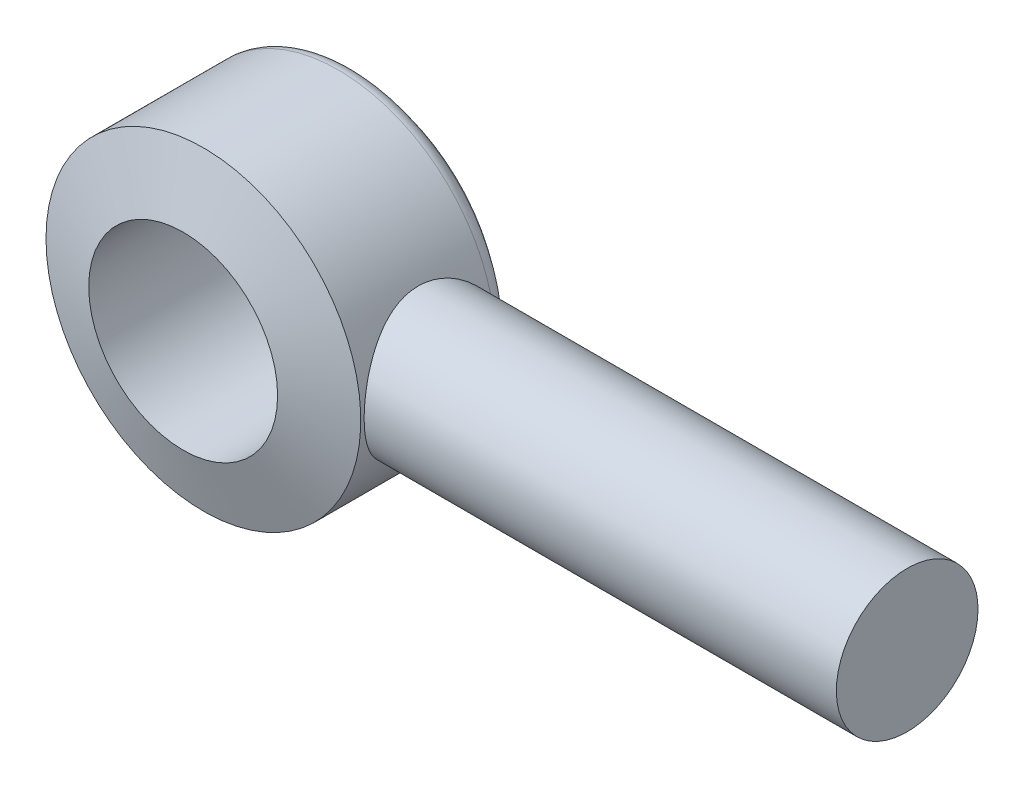
ISO-10303-21;
HEADER;
FILE_DESCRIPTION(('STEP AP214'),'2;1');
FILE_NAME('part.step','',(''),(''),'','','');
FILE_SCHEMA(('AUTOMOTIVE_DESIGN { 1 0 10303 214 1 1 1 1 }'));
ENDSEC;
DATA;
#1=APPLICATION_CONTEXT('core data for automotive mechanical design processes');
#2=APPLICATION_PROTOCOL_DEFINITION('international standard','automotive_design',2000,#1);
#3=PRODUCT_CONTEXT('',#1,'mechanical');
#4=PRODUCT('Part','Part','',(#3));
#5=PRODUCT_RELATED_PRODUCT_CATEGORY('part','',(#4));
#6=PRODUCT_DEFINITION_FORMATION('','',#4);
#7=PRODUCT_DEFINITION_CONTEXT('part definition',#1,'design');
#8=PRODUCT_DEFINITION('design','',#6,#7);
#9=PRODUCT_DEFINITION_SHAPE('','',#8);
#10=(LENGTH_UNIT() NAMED_UNIT(*) SI_UNIT(.MILLI.,.METRE.));
#11=(NAMED_UNIT(*) PLANE_ANGLE_UNIT() SI_UNIT($,.RADIAN.));
#12=(NAMED_UNIT(*) SI_UNIT($,.STERADIAN.) SOLID_ANGLE_UNIT());
#13=UNCERTAINTY_MEASURE_WITH_UNIT(LENGTH_MEASURE(1.E-05),#10,'distance_accuracy_value','');
#14=(GEOMETRIC_REPRESENTATION_CONTEXT(3) GLOBAL_UNCERTAINTY_ASSIGNED_CONTEXT((#13)) GLOBAL_UNIT_ASSIGNED_CONTEXT((#10,
#11,#12)) REPRESENTATION_CONTEXT('',''));
#15=CARTESIAN_POINT('',(0.,0.,0.));
#16=DIRECTION('',(0.,0.,1.));
#17=DIRECTION('',(1.,0.,0.));
#18=AXIS2_PLACEMENT_3D('',#15,#16,#17);
#19=CARTESIAN_POINT('',(0.,0.,-10.));
#20=DIRECTION('',(0.,0.,-1.));
#21=DIRECTION('',(-1.,0.,0.));
#22=AXIS2_PLACEMENT_3D('',#19,#20,#21);
#23=CYLINDRICAL_SURFACE('',#22,20.);
#24=CARTESIAN_POINT('',(0.,0.,9.43017797204027));
#25=DIRECTION('',(0.,0.,-1.));
#26=DIRECTION('',(-1.,0.,0.));
#27=AXIS2_PLACEMENT_3D('',#24,#25,#26);
#28=CIRCLE('',#27,20.);
#29=CARTESIAN_POINT('',(-20.,0.,9.43017797204027));
#30=VERTEX_POINT('',#29);
#31=EDGE_CURVE('E83',#30,#30,#28,.T.);
#32=ORIENTED_EDGE('',*,*,#31,.T.);
#33=EDGE_LOOP('',(#32));
#34=FACE_BOUND('',#33,.T.);
#35=CARTESIAN_POINT('',(20.,0.,9.));
#36=CARTESIAN_POINT('',(19.9999985064092,-0.239429787521762,8.99999822674481));
#37=CARTESIAN_POINT('',(19.9956892903757,-0.478916426072318,8.99043321478664));
#38=CARTESIAN_POINT('',(19.9785592942605,-0.956162020026687,8.95226864130849));
#39=CARTESIAN_POINT('',(19.965733761182,-1.19391993566993,8.92365845056188));
#40=CARTESIAN_POINT('',(19.9318736584215,-1.66631126554467,8.84764081808999));
#41=CARTESIAN_POINT('',(19.9108226830594,-1.90093746029759,8.80019580719452));
#42=CARTESIAN_POINT('',(19.8610585063253,-2.36491141890117,8.68701475770776));
#43=CARTESIAN_POINT('',(19.8323447580828,-2.5942588047487,8.62127741363003));
#44=CARTESIAN_POINT('',(19.7681022982331,-3.04529734881632,8.47244678985055));
#45=CARTESIAN_POINT('',(19.7325992510457,-3.26701374275262,8.38941876914481));
#46=CARTESIAN_POINT('',(19.6555728959035,-3.70234023900251,8.20660801672636));
#47=CARTESIAN_POINT('',(19.6140494060633,-3.91595009616117,8.10682477880271));
#48=CARTESIAN_POINT('',(19.5259822178753,-4.33377259634432,7.89136497837355));
#49=CARTESIAN_POINT('',(19.4794409340425,-4.53798969218329,7.77569605263848));
#50=CARTESIAN_POINT('',(19.3823697488822,-4.93616834197874,7.52921588944175));
#51=CARTESIAN_POINT('',(19.3318383966538,-5.13012612215117,7.39839913566407));
#52=CARTESIAN_POINT('',(19.2252516511163,-5.51651224739533,7.11536110827233));
#53=CARTESIAN_POINT('',(19.1690457622511,-5.70834540295415,6.9623837252373));
#54=CARTESIAN_POINT('',(19.0548708618976,-6.07860491986334,6.64157900949721));
#55=CARTESIAN_POINT('',(18.9969017713971,-6.25703067915748,6.47375101066448));
#56=CARTESIAN_POINT('',(18.880592194074,-6.59969716817025,6.12404836453865));
#57=CARTESIAN_POINT('',(18.8222514632243,-6.76392725578708,5.94216336929638));
#58=CARTESIAN_POINT('',(18.7067409433213,-7.07712505064923,5.56545458817474));
#59=CARTESIAN_POINT('',(18.6495707822957,-7.2260976684338,5.37063499871256));
#60=CARTESIAN_POINT('',(18.5345311652062,-7.516447766657,4.95688022972719));
#61=CARTESIAN_POINT('',(18.4768262488237,-7.65683040733289,4.73719938586506));
#62=CARTESIAN_POINT('',(18.3662455819156,-7.9184082128268,4.28565725378554));
#63=CARTESIAN_POINT('',(18.3133678154643,-8.03961140306554,4.05380111455893));
#64=CARTESIAN_POINT('',(18.2142115054809,-8.26179801329656,3.57928810590723));
#65=CARTESIAN_POINT('',(18.1679314380325,-8.36278610469526,3.33663374766755));
#66=CARTESIAN_POINT('',(18.0836512940779,-8.54350708508813,2.8421404498764));
#67=CARTESIAN_POINT('',(18.0456504851488,-8.62324185439244,2.59030232506773));
#68=CARTESIAN_POINT('',(17.9811920446581,-8.75682239914521,2.09302617540733));
#69=CARTESIAN_POINT('',(17.9542263959317,-8.81182321590082,1.84796444302761));
#70=CARTESIAN_POINT('',(17.9100690134956,-8.90123170952957,1.35323614575337));
#71=CARTESIAN_POINT('',(17.8928769341626,-8.93564011461572,1.10356974401648));
#72=CARTESIAN_POINT('',(17.8689540131125,-8.983384615928,0.601878211112212));
#73=CARTESIAN_POINT('',(17.862216946963,-8.99673325024852,0.34985457332427));
#74=CARTESIAN_POINT('',(17.8594595772848,-9.00220633858546,-0.154473717097972));
#75=CARTESIAN_POINT('',(17.8634385573798,-8.99433221136058,-0.406778349820423));
#76=CARTESIAN_POINT('',(17.8810873984619,-8.95918756232712,-0.886151715448358));
#77=CARTESIAN_POINT('',(17.8938260789646,-8.93378003766404,-1.11339448767851));
#78=CARTESIAN_POINT('',(17.927571759319,-8.86586762542431,-1.56476590212196));
#79=CARTESIAN_POINT('',(17.9485815636106,-8.82335693867436,-1.78889346136545));
#80=CARTESIAN_POINT('',(17.9981983804691,-8.72169967723377,-2.23242328121026));
#81=CARTESIAN_POINT('',(18.0268038175066,-8.66255655238773,-2.4518265115671));
#82=CARTESIAN_POINT('',(18.0907644553137,-8.52817531283848,-2.88472086941824));
#83=CARTESIAN_POINT('',(18.1261223186502,-8.45293084775861,-3.09820962660947));
#84=CARTESIAN_POINT('',(18.2034273739602,-8.28516411480901,-3.52268171477743));
#85=CARTESIAN_POINT('',(18.245503223284,-8.19229591841558,-3.73350468647988));
#86=CARTESIAN_POINT('',(18.3345094937334,-7.99111131313484,-4.14668124990887));
#87=CARTESIAN_POINT('',(18.3814419924008,-7.88278828552695,-4.34903116467067));
#88=CARTESIAN_POINT('',(18.4789403884393,-7.65143878691375,-4.74425148038292));
#89=CARTESIAN_POINT('',(18.529506718669,-7.52841056307743,-4.9371207473839));
#90=CARTESIAN_POINT('',(18.6330430772117,-7.26837600260638,-5.31251862824745));
#91=CARTESIAN_POINT('',(18.6860132626551,-7.13136875148583,-5.49504656438016));
#92=CARTESIAN_POINT('',(18.7985189099995,-6.82965137855831,-5.8667508151223));
#93=CARTESIAN_POINT('',(18.8581795779558,-6.66354094355835,-6.05475471792475));
#94=CARTESIAN_POINT('',(18.9773217315881,-6.31624490447285,-6.41621795234593));
#95=CARTESIAN_POINT('',(19.0368032659127,-6.13506386579452,-6.58968165695454));
#96=CARTESIAN_POINT('',(19.1541031253549,-5.75840783413117,-6.92125209864595));
#97=CARTESIAN_POINT('',(19.2119202579301,-5.56292293099043,-7.0793480084468));
#98=CARTESIAN_POINT('',(19.3243324773812,-5.15888778973217,-7.37896361082567));
#99=CARTESIAN_POINT('',(19.3789288480891,-4.95034282678133,-7.52048993068443));
#100=CARTESIAN_POINT('',(19.4851436633983,-4.51453513177018,-7.79016476175079));
#101=CARTESIAN_POINT('',(19.5366153637798,-4.28689080080715,-7.9177557300782));
#102=CARTESIAN_POINT('',(19.6331930852758,-3.82027307220348,-8.15314635835191));
#103=CARTESIAN_POINT('',(19.6782988971242,-3.58129930247428,-8.26094536771092));
#104=CARTESIAN_POINT('',(19.7608038392733,-3.09381683800418,-8.45559807156982));
#105=CARTESIAN_POINT('',(19.7982069784098,-2.84531318336057,-8.5424626653597));
#106=CARTESIAN_POINT('',(19.8642006994343,-2.34057316338715,-8.69431727759214));
#107=CARTESIAN_POINT('',(19.8927920789953,-2.08433750029415,-8.75930927607173));
#108=CARTESIAN_POINT('',(19.9385785973443,-1.58475659078038,-8.8627820531026));
#109=CARTESIAN_POINT('',(19.9564408763815,-1.3417946800013,-8.90282253637629));
#110=CARTESIAN_POINT('',(19.9833039076318,-0.852923203762495,-8.96287681773965));
#111=CARTESIAN_POINT('',(19.9923050787014,-0.607013778185294,-8.98289156242817));
#112=CARTESIAN_POINT('',(20.0011908631786,-0.11429222738638,-9.00265034352046));
#113=CARTESIAN_POINT('',(20.0010782152303,0.132519604376326,-9.00240046931204));
#114=CARTESIAN_POINT('',(19.9917460584114,0.625112640198912,-8.9816478341786));
#115=CARTESIAN_POINT('',(19.9825268188492,0.870893874520698,-8.96114567217257));
#116=CARTESIAN_POINT('',(19.956065789783,1.34474026634219,-8.90197788970906));
#117=CARTESIAN_POINT('',(19.9393402215752,1.57298140187488,-8.86447967777511));
#118=CARTESIAN_POINT('',(19.8984816575205,2.02534431087012,-8.77218815009011));
#119=CARTESIAN_POINT('',(19.8743461054333,2.24946463444314,-8.71738886576039));
#120=CARTESIAN_POINT('',(19.8192555232196,2.69199160485396,-8.59104867903111));
#121=CARTESIAN_POINT('',(19.7883025820127,2.910399979009,-8.51951290445087));
#122=CARTESIAN_POINT('',(19.7202793913881,3.34035601239371,-8.36029898867279));
#123=CARTESIAN_POINT('',(19.683206768087,3.55190097098524,-8.27261458173295));
#124=CARTESIAN_POINT('',(19.6025680633345,3.97325271295613,-8.07890250865154));
#125=CARTESIAN_POINT('',(19.5588376911843,4.18280716676961,-7.97239470838378));
#126=CARTESIAN_POINT('',(19.4667686761903,4.59227389693774,-7.74377379226145));
#127=CARTESIAN_POINT('',(19.4184280289757,4.79218192199118,-7.62165388093191));
#128=CARTESIAN_POINT('',(19.3182414582239,5.1813047826268,-7.36265667898538));
#129=CARTESIAN_POINT('',(19.2663950532817,5.37051814305889,-7.22577736008958));
#130=CARTESIAN_POINT('',(19.1603566360018,5.73735089704924,-6.93809376996048));
#131=CARTESIAN_POINT('',(19.1061644856957,5.9149696071058,-6.78728867906948));
#132=CARTESIAN_POINT('',(18.9921091223955,6.27198115730559,-6.45954492415076));
#133=CARTESIAN_POINT('',(18.932147429454,6.45030692935816,-6.28147645658624));
#134=CARTESIAN_POINT('',(18.8124874463192,6.79139001979559,-5.91104017905654));
#135=CARTESIAN_POINT('',(18.7527890790413,6.95415222883229,-5.71867689504691));
#136=CARTESIAN_POINT('',(18.6352274862803,7.26330947580394,-5.32051613207802));
#137=CARTESIAN_POINT('',(18.5773652212848,7.40969604534894,-5.11471178862727));
#138=CARTESIAN_POINT('',(18.4651553104776,7.68506041699707,-4.69081355900933));
#139=CARTESIAN_POINT('',(18.4108081016454,7.81403605679319,-4.47271815114287));
#140=CARTESIAN_POINT('',(18.3059488705779,8.05668444955543,-4.01964744492819));
#141=CARTESIAN_POINT('',(18.2555727512637,8.16987395967666,-3.78438116159368));
#142=CARTESIAN_POINT('',(18.1620334685313,8.37575861288127,-3.30378099772061));
#143=CARTESIAN_POINT('',(18.1188669108787,8.46846340676979,-3.05845192285447));
#144=CARTESIAN_POINT('',(18.0413522087471,8.63237146197948,-2.55950560846046));
#145=CARTESIAN_POINT('',(18.0069988325188,8.7035874840771,-2.30589338731715));
#146=CARTESIAN_POINT('',(17.9484608618576,8.82367465748678,-1.79228691938852));
#147=CARTESIAN_POINT('',(17.9242750777492,8.87254842304895,-1.53229342302434));
#148=CARTESIAN_POINT('',(17.8886993541826,8.94404152171661,-1.03083770963064));
#149=CARTESIAN_POINT('',(17.8763859461874,8.96856120068133,-0.789710504285614));
#150=CARTESIAN_POINT('',(17.8615562025687,8.9980603787464,-0.305966922249479));
#151=CARTESIAN_POINT('',(17.85903927899,9.00304105051869,-0.0633506358038569));
#152=CARTESIAN_POINT('',(17.8638967193331,8.99339869907906,0.421339936682433));
#153=CARTESIAN_POINT('',(17.871269109852,8.97877958698488,0.663414321204597));
#154=CARTESIAN_POINT('',(17.8956256300312,8.93013553038372,1.1451097507879));
#155=CARTESIAN_POINT('',(17.9126095914113,8.89611092562984,1.38473083872681));
#156=CARTESIAN_POINT('',(17.9542019795544,8.81184885035319,1.84457158285318));
#157=CARTESIAN_POINT('',(17.9782576373439,8.76277836929556,2.06505686910616));
#158=CARTESIAN_POINT('',(18.0335240236974,8.64847033972161,2.50094996426581));
#159=CARTESIAN_POINT('',(18.0647371853071,8.58322729306297,2.71635601907014));
#160=CARTESIAN_POINT('',(18.1334100859646,8.43717617370366,3.14076493187075));
#161=CARTESIAN_POINT('',(18.1708689403327,8.35637030516923,3.34976869177283));
#162=CARTESIAN_POINT('',(18.2510202909687,8.17983194389311,3.76036599179168));
#163=CARTESIAN_POINT('',(18.2937147025314,8.08409398512476,3.96195678479782));
#164=CARTESIAN_POINT('',(18.4337980772545,7.76222657972639,4.5795271498112));
#165=CARTESIAN_POINT('',(18.5385811736341,7.51078499351191,4.98096554827426));
#166=CARTESIAN_POINT('',(18.7562139113691,6.94944527163252,5.73825741073852));
#167=CARTESIAN_POINT('',(18.8690670144285,6.6395219551356,6.09409112721924));
#168=CARTESIAN_POINT('',(19.0414534362523,6.12049570385006,6.60344800278789));
#169=CARTESIAN_POINT('',(19.1019265722538,5.92952447780279,6.77546107258306));
#170=CARTESIAN_POINT('',(19.2204841520022,5.53314695253534,7.10283722770465));
#171=CARTESIAN_POINT('',(19.2785693393954,5.32774520202814,7.25820552106485));
#172=CARTESIAN_POINT('',(19.3908219301757,4.90349025018201,7.55131240400399));
#173=CARTESIAN_POINT('',(19.4449864749656,4.68462744502553,7.68903818538079));
#174=CARTESIAN_POINT('',(19.5478628538564,4.23488494202963,7.9456123952859));
#175=CARTESIAN_POINT('',(19.5965750981269,4.00400615005464,8.06446224410902));
#176=CARTESIAN_POINT('',(19.6867289810764,3.53403247209939,8.28111759450921));
#177=CARTESIAN_POINT('',(19.728237249603,3.2950403909157,8.37911808299119));
#178=CARTESIAN_POINT('',(19.8033675484772,2.80841945542816,8.55451052720515));
#179=CARTESIAN_POINT('',(19.8369904518373,2.56079156071159,8.63190476444587));
#180=CARTESIAN_POINT('',(19.895281576305,2.0594421848868,8.76503291255901));
#181=CARTESIAN_POINT('',(19.9199726640305,1.80573806291927,8.8208221612666));
#182=CARTESIAN_POINT('',(19.9597536707627,1.29384700046391,8.91029659978674));
#183=CARTESIAN_POINT('',(19.9748501828208,1.03566326380758,8.94399696879227));
#184=CARTESIAN_POINT('',(19.9899382797138,0.64736594221831,8.97762287927609));
#185=CARTESIAN_POINT('',(19.9937081356488,0.518072296353714,8.98601072992026));
#186=CARTESIAN_POINT('',(19.9987394171989,0.259191322269681,8.99719980844412));
#187=CARTESIAN_POINT('',(20.0000008084847,0.129603990055338,9.00000095986782));
#188=CARTESIAN_POINT('',(20.,0.,9.));
#189=B_SPLINE_CURVE_WITH_KNOTS('',3,(#35,#36,#37,#38,#39,#40,#41,#42,#43,#44,#45,#46,#47,#48,
#49,#50,#51,#52,#53,#54,#55,#56,#57,#58,#59,#60,#61,#62,#63,#64,#65,#66,#67,#68,#69,#70,#71,#72,
#73,#74,#75,#76,#77,#78,#79,#80,#81,#82,#83,#84,#85,#86,#87,#88,#89,#90,#91,#92,#93,#94,#95,#96,
#97,#98,#99,#100,#101,#102,#103,#104,#105,#106,#107,#108,#109,#110,#111,#112,#113,#114,#115,
#116,#117,#118,#119,#120,#121,#122,#123,#124,#125,#126,#127,#128,#129,#130,#131,#132,#133,#134,
#135,#136,#137,#138,#139,#140,#141,#142,#143,#144,#145,#146,#147,#148,#149,#150,#151,#152,#153,
#154,#155,#156,#157,#158,#159,#160,#161,#162,#163,#164,#165,#166,#167,#168,#169,#170,#171,#172,
#173,#174,#175,#176,#177,#178,#179,#180,#181,#182,#183,#184,#185,#186,#187,#188),.UNSPECIFIED.,
.T.,.F.,(4,2,2,2,2,2,2,2,2,2,2,2,2,2,2,2,2,2,2,2,2,2,2,2,2,2,2,2,2,2,2,2,2,2,2,2,2,2,2,2,2,2,2,
2,2,2,2,2,2,2,2,2,2,2,2,2,2,2,2,2,2,2,2,2,2,2,2,2,2,2,2,2,2,2,2,2,4),(0.,0.718159532639473,
1.43672021076597,2.15672143749976,2.87677406243432,3.59415675860251,4.31156113233702,
5.02862182569182,5.74594447393202,6.50027585786822,7.25464109467397,8.00956704019649,
8.76424924802547,9.56429618429399,10.364007459793,11.1635337201168,11.9629892217756,
12.7197566749701,13.4764973648845,14.2327873532403,14.9890267842557,15.6752612076834,
16.3617285091454,17.0480535307425,17.7346497398257,18.4364610382131,19.1385738031288,
19.8407703421478,20.5430128472404,21.3157604578396,22.0882748231005,22.861329572427,
23.634074061759,24.4310112061388,25.2279745421852,26.0245220466452,26.820997423493,
27.5606908534938,28.3003493171917,29.0397855190965,29.7791998543792,30.4741133570495,
31.1692668556164,31.8642076474478,32.5594186496945,33.2759532001802,33.9928007049743,
34.7097468467973,35.426735214318,36.2029926119804,36.9790052734397,37.7554173997085,
38.53192586201,39.3285593118364,40.1248166459263,40.9206002000389,41.716290616287,
42.4433761222668,43.1704179901121,43.8973147990538,44.6241988818124,45.3049160279127,
45.9858649136921,46.6667174273427,47.347819760708,48.7968393583871,50.2464842987708,
51.0377977635622,51.8288629042937,52.6204991304763,53.4120757627796,54.1958878953199,
54.9796132086436,55.7613176401041,56.5424843296088,56.931220702525,57.3199623954018),.UNSPECIFIED.);
#190=CARTESIAN_POINT('',(19.4531466419182,4.64489889319724,-7.70875568895364));
#191=VERTEX_POINT('',#190);
#192=CARTESIAN_POINT('',(19.4531466419182,-4.64489889319724,-7.70875568895363));
#193=VERTEX_POINT('',#192);
#194=EDGE_CURVE('E86',#191,#193,#189,.T.);
#195=ORIENTED_EDGE('',*,*,#194,.F.);
#196=CARTESIAN_POINT('',(0.,0.,-7.70875568895363));
#197=DIRECTION('',(0.,0.,-1.));
#198=DIRECTION('',(-1.,0.,0.));
#199=AXIS2_PLACEMENT_3D('',#196,#197,#198);
#200=CIRCLE('',#199,20.);
#201=EDGE_CURVE('E78',#193,#191,#200,.T.);
#202=ORIENTED_EDGE('',*,*,#201,.F.);
#203=EDGE_LOOP('',(#195,#202));
#204=FACE_BOUND('',#203,.T.);
#205=ADVANCED_FACE('F58',(#34,#204),#23,.T.);
#206=CARTESIAN_POINT('',(0.,0.,-7.70875568895364));
#207=DIRECTION('',(0.,0.,-1.));
#208=DIRECTION('',(-1.,0.,0.));
#209=AXIS2_PLACEMENT_3D('',#206,#207,#208);
#210=TOROIDAL_SURFACE('',#209,18.,2.);
#211=CARTESIAN_POINT('',(0.,0.,-9.29443556009874));
#212=DIRECTION('',(0.,0.,-1.));
#213=DIRECTION('',(-1.,0.,0.));
#214=AXIS2_PLACEMENT_3D('',#211,#212,#213);
#215=CIRCLE('',#214,19.218859855047);
#216=CARTESIAN_POINT('',(-19.218859855047,0.,-9.29443556009874));
#217=VERTEX_POINT('',#216);
#218=EDGE_CURVE('E84',#217,#217,#215,.T.);
#219=ORIENTED_EDGE('',*,*,#218,.F.);
#220=EDGE_LOOP('',(#219));
#221=FACE_BOUND('',#220,.T.);
#222=CARTESIAN_POINT('',(19.453067377915,-4.64523080054163,-7.70855568895363));
#223=CARTESIAN_POINT('',(19.4865263653948,-4.50512479807231,-7.79303008417415));
#224=CARTESIAN_POINT('',(19.5136952766141,-4.3616994849786,-7.87420755796514));
#225=CARTESIAN_POINT('',(19.5573436868632,-4.0695871058651,-8.02904390849179));
#226=CARTESIAN_POINT('',(19.5738424227221,-3.92091002148674,-8.1027161129357));
#227=CARTESIAN_POINT('',(19.5980956400327,-3.61980921640281,-8.24162704699394));
#228=CARTESIAN_POINT('',(19.6058876523183,-3.46740449302331,-8.30690089193046));
#229=CARTESIAN_POINT('',(19.6147616551993,-3.15899016616777,-8.4290153908638));
#230=CARTESIAN_POINT('',(19.6158397336656,-3.00297851410303,-8.48585110924217));
#231=CARTESIAN_POINT('',(19.6125113020598,-2.60872328560028,-8.61724201363166));
#232=CARTESIAN_POINT('',(19.6050667640383,-2.36866366022399,-8.68629095378198));
#233=CARTESIAN_POINT('',(19.5858380817061,-1.88374741355705,-8.80419217514318));
#234=CARTESIAN_POINT('',(19.5740523000782,-1.63888901542238,-8.85303682145043));
#235=CARTESIAN_POINT('',(19.5577772139124,-1.26897774854391,-8.91096608034697));
#236=CARTESIAN_POINT('',(19.5525818604358,-1.14511809082886,-8.92772813773474));
#237=CARTESIAN_POINT('',(19.543317998123,-0.896770522157785,-8.95608272273469));
#238=CARTESIAN_POINT('',(19.5392493707307,-0.772282678705082,-8.96767579431422));
#239=CARTESIAN_POINT('',(19.5327613668194,-0.52293270086634,-8.98566420475187));
#240=CARTESIAN_POINT('',(19.5303414162267,-0.398070711985091,-8.99206135299354));
#241=CARTESIAN_POINT('',(19.5274566515453,-0.148166086599487,-8.99964855351271));
#242=CARTESIAN_POINT('',(19.5269918216691,-0.0231234515619891,-9.00083864783668));
#243=CARTESIAN_POINT('',(19.5280791507434,0.226830791811226,-8.9980086298493));
#244=CARTESIAN_POINT('',(19.5296302644346,0.351742434467253,-8.99399121761374));
#245=CARTESIAN_POINT('',(19.5345406845132,0.601246705397682,-8.98076362631764));
#246=CARTESIAN_POINT('',(19.5379000110735,0.725839330097457,-8.97155338932455));
#247=CARTESIAN_POINT('',(19.550095542197,1.0989115407005,-8.93615083035356));
#248=CARTESIAN_POINT('',(19.5610487157598,1.34662674015319,-8.90218733621413));
#249=CARTESIAN_POINT('',(19.5832584860941,1.83782741326404,-8.81388592497461));
#250=CARTESIAN_POINT('',(19.594514445559,2.08132023044922,-8.75958810297724));
#251=CARTESIAN_POINT('',(19.610905824712,2.56311563247595,-8.63090400089671));
#252=CARTESIAN_POINT('',(19.6160446886747,2.8014210638311,-8.55652905435327));
#253=CARTESIAN_POINT('',(19.6141780373774,3.17661882558848,-8.42207648391577));
#254=CARTESIAN_POINT('',(19.6112217703376,3.31579432520448,-8.36825739595492));
#255=CARTESIAN_POINT('',(19.5994130189231,3.59104429546343,-8.25388387029791));
#256=CARTESIAN_POINT('',(19.5905633084079,3.72712019384525,-8.19333261238747));
#257=CARTESIAN_POINT('',(19.5655323111602,3.99618179420556,-8.06552978555064));
#258=CARTESIAN_POINT('',(19.5493184459563,4.129150974092,-7.99824949041174));
#259=CARTESIAN_POINT('',(19.5081269005561,4.39072564019137,-7.85771793140184));
#260=CARTESIAN_POINT('',(19.483136996315,4.51932476395593,-7.78445844900942));
#261=CARTESIAN_POINT('',(19.453067377915,4.64523080054163,-7.70855568895363));
#262=B_SPLINE_CURVE_WITH_KNOTS('',3,(#222,#223,#224,#225,#226,#227,#228,#229,#230,#231,#232,
#233,#234,#235,#236,#237,#238,#239,#240,#241,#242,#243,#244,#245,#246,#247,#248,#249,#250,#251,
#252,#253,#254,#255,#256,#257,#258,#259,#260,#261),.UNSPECIFIED.,.F.,.F.,(4,2,2,2,2,2,2,2,2,2,2,
2,2,2,2,2,2,2,2,4),(0.,0.500577357174767,1.00024970908592,1.49775978413729,1.99555972527918,
2.7442467571366,3.49321644885157,3.86841308384614,4.24357022503442,4.61859666865517,
4.99362008396697,5.36844912857337,5.74328235495552,6.49312439723858,7.24149562442341,
7.989445276186,8.43693673872202,8.88421772974093,9.33349702765005,9.78340462001646),.UNSPECIFIED.);
#263=EDGE_CURVE('E12',#193,#191,#262,.T.);
#264=ORIENTED_EDGE('',*,*,#263,.F.);
#265=ORIENTED_EDGE('',*,*,#201,.T.);
#266=EDGE_LOOP('',(#264,#265));
#267=FACE_BOUND('',#266,.T.);
#268=ADVANCED_FACE('F80',(#221,#267),#210,.T.);
#269=CARTESIAN_POINT('',(0.,0.,-9.29443556009874));
#270=DIRECTION('',(0.,0.,1.));
#271=DIRECTION('',(1.,0.,0.));
#272=AXIS2_PLACEMENT_3D('',#269,#270,#271);
#273=CONICAL_SURFACE('',#272,19.218859855047,0.915454960677316);
#274=CARTESIAN_POINT('',(0.,0.,-10.5856798711451));
#275=DIRECTION('',(0.,0.,-1.));
#276=DIRECTION('',(-1.,0.,0.));
#277=AXIS2_PLACEMENT_3D('',#274,#275,#276);
#278=CIRCLE('',#277,17.5390111798457);
#279=CARTESIAN_POINT('',(-17.5390111798457,0.,-10.5856798711451));
#280=VERTEX_POINT('',#279);
#281=EDGE_CURVE('E72',#280,#280,#278,.T.);
#282=ORIENTED_EDGE('',*,*,#281,.F.);
#283=EDGE_LOOP('',(#282));
#284=FACE_BOUND('',#283,.T.);
#285=ORIENTED_EDGE('',*,*,#218,.T.);
#286=EDGE_LOOP('',(#285));
#287=FACE_BOUND('',#286,.T.);
#288=ADVANCED_FACE('F60',(#284,#287),#273,.T.);
#289=CARTESIAN_POINT('',(0.,0.,-9.));
#290=DIRECTION('',(0.,0.,-1.));
#291=DIRECTION('',(-1.,0.,0.));
#292=AXIS2_PLACEMENT_3D('',#289,#290,#291);
#293=TOROIDAL_SURFACE('',#292,16.3201513247987,2.);
#294=CARTESIAN_POINT('',(0.,0.,-11.));
#295=DIRECTION('',(0.,0.,-1.));
#296=DIRECTION('',(-1.,0.,0.));
#297=AXIS2_PLACEMENT_3D('',#294,#295,#296);
#298=CIRCLE('',#297,16.3201513247987);
#299=CARTESIAN_POINT('',(-16.3201513247987,0.,-11.));
#300=VERTEX_POINT('',#299);
#301=EDGE_CURVE('E137',#300,#300,#298,.T.);
#302=ORIENTED_EDGE('',*,*,#301,.F.);
#303=EDGE_LOOP('',(#302));
#304=FACE_BOUND('',#303,.T.);
#305=ORIENTED_EDGE('',*,*,#281,.T.);
#306=EDGE_LOOP('',(#305));
#307=FACE_BOUND('',#306,.T.);
#308=ADVANCED_FACE('F142',(#304,#307),#293,.T.);
#309=CARTESIAN_POINT('',(0.,0.,-11.));
#310=DIRECTION('',(0.,0.,1.));
#311=DIRECTION('',(1.,0.,0.));
#312=AXIS2_PLACEMENT_3D('',#309,#310,#311);
#313=PLANE('',#312);
#314=CARTESIAN_POINT('',(0.,0.,-11.));
#315=DIRECTION('',(0.,0.,-1.));
#316=DIRECTION('',(-1.,0.,0.));
#317=AXIS2_PLACEMENT_3D('',#314,#315,#316);
#318=CIRCLE('',#317,12.);
#319=CARTESIAN_POINT('',(-12.,0.,-11.));
#320=VERTEX_POINT('',#319);
#321=EDGE_CURVE('E134',#320,#320,#318,.T.);
#322=ORIENTED_EDGE('',*,*,#321,.F.);
#323=EDGE_LOOP('',(#322));
#324=FACE_BOUND('',#323,.T.);
#325=ORIENTED_EDGE('',*,*,#301,.T.);
#326=EDGE_LOOP('',(#325));
#327=FACE_BOUND('',#326,.T.);
#328=ADVANCED_FACE('F150',(#324,#327),#313,.F.);
#329=CARTESIAN_POINT('',(0.,0.,-10.));
#330=DIRECTION('',(0.,0.,-1.));
#331=DIRECTION('',(-1.,0.,0.));
#332=AXIS2_PLACEMENT_3D('',#329,#330,#331);
#333=CYLINDRICAL_SURFACE('',#332,12.);
#334=ORIENTED_EDGE('',*,*,#321,.T.);
#335=EDGE_LOOP('',(#334));
#336=FACE_BOUND('',#335,.T.);
#337=CARTESIAN_POINT('',(0.,0.,-10.));
#338=DIRECTION('',(0.,0.,-1.));
#339=DIRECTION('',(-1.,0.,0.));
#340=AXIS2_PLACEMENT_3D('',#337,#338,#339);
#341=CIRCLE('',#340,12.);
#342=CARTESIAN_POINT('',(-12.,0.,-10.));
#343=VERTEX_POINT('',#342);
#344=EDGE_CURVE('E131',#343,#343,#341,.T.);
#345=ORIENTED_EDGE('',*,*,#344,.F.);
#346=EDGE_LOOP('',(#345));
#347=FACE_BOUND('',#346,.T.);
#348=ADVANCED_FACE('F155',(#336,#347),#333,.F.);
#349=CARTESIAN_POINT('',(0.,0.,-10.));
#350=DIRECTION('',(0.,0.,-1.));
#351=DIRECTION('',(-1.,0.,0.));
#352=AXIS2_PLACEMENT_3D('',#349,#350,#351);
#353=PLANE('',#352);
#354=ORIENTED_EDGE('',*,*,#344,.T.);
#355=EDGE_LOOP('',(#354));
#356=FACE_BOUND('',#355,.T.);
#357=ADVANCED_FACE('F162',(#356),#353,.T.);
#358=CARTESIAN_POINT('',(0.,0.,-7.4973249801723));
#359=DIRECTION('',(0.,0.,1.));
#360=DIRECTION('',(1.,0.,0.));
#361=AXIS2_PLACEMENT_3D('',#358,#359,#360);
#362=PLANE('',#361);
#363=CARTESIAN_POINT('',(0.,0.,-7.4973249801723));
#364=DIRECTION('',(0.,0.,-1.));
#365=DIRECTION('',(-1.,0.,0.));
#366=AXIS2_PLACEMENT_3D('',#363,#364,#365);
#367=CIRCLE('',#366,12.);
#368=CARTESIAN_POINT('',(-12.,0.,-7.4973249801723));
#369=VERTEX_POINT('',#368);
#370=EDGE_CURVE('E128',#369,#369,#367,.T.);
#371=ORIENTED_EDGE('',*,*,#370,.F.);
#372=EDGE_LOOP('',(#371));
#373=FACE_BOUND('',#372,.T.);
#374=ADVANCED_FACE('F166',(#373),#362,.T.);
#375=CARTESIAN_POINT('',(0.,0.,-10.));
#376=DIRECTION('',(0.,0.,-1.));
#377=DIRECTION('',(-1.,0.,0.));
#378=AXIS2_PLACEMENT_3D('',#375,#376,#377);
#379=CYLINDRICAL_SURFACE('',#378,12.);
#380=ORIENTED_EDGE('',*,*,#370,.T.);
#381=EDGE_LOOP('',(#380));
#382=FACE_BOUND('',#381,.T.);
#383=CARTESIAN_POINT('',(0.,0.,12.));
#384=DIRECTION('',(0.,0.,-1.));
#385=DIRECTION('',(-1.,0.,0.));
#386=AXIS2_PLACEMENT_3D('',#383,#384,#385);
#387=CIRCLE('',#386,12.);
#388=CARTESIAN_POINT('',(-12.,0.,12.));
#389=VERTEX_POINT('',#388);
#390=EDGE_CURVE('E125',#389,#389,#387,.T.);
#391=ORIENTED_EDGE('',*,*,#390,.F.);
#392=EDGE_LOOP('',(#391));
#393=FACE_BOUND('',#392,.T.);
#394=ADVANCED_FACE('F101',(#382,#393),#379,.F.);
#395=CARTESIAN_POINT('',(0.,0.,12.));
#396=DIRECTION('',(0.,0.,-1.));
#397=DIRECTION('',(-1.,0.,0.));
#398=AXIS2_PLACEMENT_3D('',#395,#396,#397);
#399=CONICAL_SURFACE('',#398,12.,1.25998006985377);
#400=ORIENTED_EDGE('',*,*,#31,.F.);
#401=EDGE_LOOP('',(#400));
#402=FACE_BOUND('',#401,.T.);
#403=ORIENTED_EDGE('',*,*,#390,.T.);
#404=EDGE_LOOP('',(#403));
#405=FACE_BOUND('',#404,.T.);
#406=ADVANCED_FACE('F93',(#402,#405),#399,.T.);
#407=CARTESIAN_POINT('',(80.,0.,0.));
#408=DIRECTION('',(-1.,0.,0.));
#409=DIRECTION('',(0.,0.,1.));
#410=AXIS2_PLACEMENT_3D('',#407,#408,#409);
#411=CYLINDRICAL_SURFACE('',#410,9.);
#412=CARTESIAN_POINT('',(80.,0.,0.));
#413=DIRECTION('',(1.,0.,0.));
#414=DIRECTION('',(0.,0.,-1.));
#415=AXIS2_PLACEMENT_3D('',#412,#413,#414);
#416=CIRCLE('',#415,9.);
#417=CARTESIAN_POINT('',(80.,0.,-9.));
#418=VERTEX_POINT('',#417);
#419=EDGE_CURVE('E88',#418,#418,#416,.T.);
#420=ORIENTED_EDGE('',*,*,#419,.F.);
#421=EDGE_LOOP('',(#420));
#422=FACE_BOUND('',#421,.T.);
#423=ORIENTED_EDGE('',*,*,#263,.T.);
#424=ORIENTED_EDGE('',*,*,#194,.T.);
#425=EDGE_LOOP('',(#423,#424));
#426=FACE_BOUND('',#425,.T.);
#427=ADVANCED_FACE('F90',(#422,#426),#411,.T.);
#428=CARTESIAN_POINT('',(80.,0.,0.));
#429=DIRECTION('',(-1.,0.,0.));
#430=DIRECTION('',(0.,0.,1.));
#431=AXIS2_PLACEMENT_3D('',#428,#429,#430);
#432=PLANE('',#431);
#433=ORIENTED_EDGE('',*,*,#419,.T.);
#434=EDGE_LOOP('',(#433));
#435=FACE_BOUND('',#434,.T.);
#436=ADVANCED_FACE('F92',(#435),#432,.F.);
#437=CLOSED_SHELL('',(#205,#268,#288,#308,#328,#348,#357,#374,#394,#406,#427,#436));
#438=MANIFOLD_SOLID_BREP('B2',#437);
#439=ADVANCED_BREP_SHAPE_REPRESENTATION('',(#18,#438),#14);
#440=SHAPE_DEFINITION_REPRESENTATION(#9,#439);
ENDSEC;
END-ISO-10303-21;
